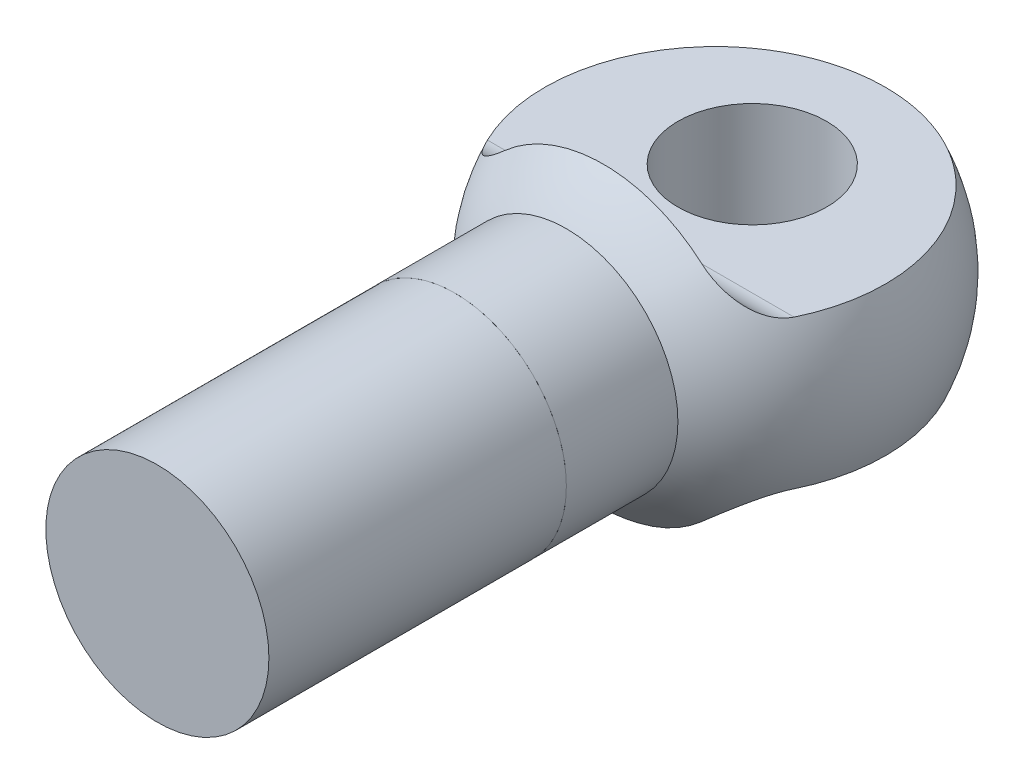
ISO-10303-21;
HEADER;
FILE_DESCRIPTION(('STEP AP214'),'2;1');
FILE_NAME('part.step','',(''),(''),'','','');
FILE_SCHEMA(('AUTOMOTIVE_DESIGN { 1 0 10303 214 1 1 1 1 }'));
ENDSEC;
DATA;
#1=APPLICATION_CONTEXT('core data for automotive mechanical design processes');
#2=APPLICATION_PROTOCOL_DEFINITION('international standard','automotive_design',2000,#1);
#3=PRODUCT_CONTEXT('',#1,'mechanical');
#4=PRODUCT('Part','Part','',(#3));
#5=PRODUCT_RELATED_PRODUCT_CATEGORY('part','',(#4));
#6=PRODUCT_DEFINITION_FORMATION('','',#4);
#7=PRODUCT_DEFINITION_CONTEXT('part definition',#1,'design');
#8=PRODUCT_DEFINITION('design','',#6,#7);
#9=PRODUCT_DEFINITION_SHAPE('','',#8);
#10=(LENGTH_UNIT() NAMED_UNIT(*) SI_UNIT(.MILLI.,.METRE.));
#11=(NAMED_UNIT(*) PLANE_ANGLE_UNIT() SI_UNIT($,.RADIAN.));
#12=(NAMED_UNIT(*) SI_UNIT($,.STERADIAN.) SOLID_ANGLE_UNIT());
#13=UNCERTAINTY_MEASURE_WITH_UNIT(LENGTH_MEASURE(1.E-05),#10,'distance_accuracy_value','');
#14=(GEOMETRIC_REPRESENTATION_CONTEXT(3) GLOBAL_UNCERTAINTY_ASSIGNED_CONTEXT((#13)) GLOBAL_UNIT_ASSIGNED_CONTEXT((#10,
#11,#12)) REPRESENTATION_CONTEXT('',''));
#15=CARTESIAN_POINT('',(0.,0.,0.));
#16=DIRECTION('',(0.,0.,1.));
#17=DIRECTION('',(1.,0.,0.));
#18=AXIS2_PLACEMENT_3D('',#15,#16,#17);
#19=CARTESIAN_POINT('',(0.,0.,-7.));
#20=DIRECTION('',(0.,0.,1.));
#21=DIRECTION('',(1.,0.,0.));
#22=AXIS2_PLACEMENT_3D('',#19,#20,#21);
#23=SPHERICAL_SURFACE('',#22,5.);
#24=CARTESIAN_POINT('',(0.,0.,-3.));
#25=DIRECTION('',(0.,0.,-1.));
#26=DIRECTION('',(-1.,0.,0.));
#27=AXIS2_PLACEMENT_3D('',#24,#25,#26);
#28=CIRCLE('',#27,3.);
#29=CARTESIAN_POINT('',(-3.,0.,-3.));
#30=VERTEX_POINT('',#29);
#31=EDGE_CURVE('E108',#30,#30,#28,.T.);
#32=ORIENTED_EDGE('',*,*,#31,.T.);
#33=EDGE_LOOP('',(#32));
#34=FACE_BOUND('',#33,.T.);
#35=CARTESIAN_POINT('',(0.,0.,-4.));
#36=DIRECTION('',(0.,0.,1.));
#37=DIRECTION('',(1.,0.,0.));
#38=AXIS2_PLACEMENT_3D('',#35,#36,#37);
#39=CIRCLE('',#38,4.);
#40=CARTESIAN_POINT('',(2.64575131106459,3.,-4.));
#41=VERTEX_POINT('',#40);
#42=CARTESIAN_POINT('',(-2.64575131106459,3.,-4.));
#43=VERTEX_POINT('',#42);
#44=EDGE_CURVE('E97',#41,#43,#39,.T.);
#45=ORIENTED_EDGE('',*,*,#44,.T.);
#46=CARTESIAN_POINT('',(-2.64575131106459,3.,-4.));
#47=CARTESIAN_POINT('',(-2.69458242415423,2.95696353764354,-4.00002383899075));
#48=CARTESIAN_POINT('',(-2.74370550671373,2.91427341673294,-4.00277899990163));
#49=CARTESIAN_POINT('',(-2.84220545277897,2.82981958380546,-4.01366065976888));
#50=CARTESIAN_POINT('',(-2.89158245101973,2.78805644375903,-4.02179038469079));
#51=CARTESIAN_POINT('',(-2.99053024429044,2.70546743096911,-4.04340162518348));
#52=CARTESIAN_POINT('',(-3.04010012746959,2.6646496926651,-4.05691856273508));
#53=CARTESIAN_POINT('',(-3.13876292442797,2.58464512082968,-4.08931723310009));
#54=CARTESIAN_POINT('',(-3.18785598452982,2.54545777402659,-4.10819726265431));
#55=CARTESIAN_POINT('',(-3.31481070913177,2.44601949470996,-4.16449549014562));
#56=CARTESIAN_POINT('',(-3.39209184791986,2.38738261465338,-4.20621643011181));
#57=CARTESIAN_POINT('',(-3.54302200764926,2.2781619656057,-4.30407595546875));
#58=CARTESIAN_POINT('',(-3.61667840049503,2.22756134233096,-4.36018370336249));
#59=CARTESIAN_POINT('',(-3.73928754899963,2.15008757295993,-4.47002509292647));
#60=CARTESIAN_POINT('',(-3.78956497050251,2.1204910962389,-4.5203546033238));
#61=CARTESIAN_POINT('',(-3.88574802317231,2.06961178003133,-4.62860338906412));
#62=CARTESIAN_POINT('',(-3.93166920177132,2.04829846360513,-4.68649377358041));
#63=CARTESIAN_POINT('',(-4.00214453296941,2.02206121396138,-4.7871916154429));
#64=CARTESIAN_POINT('',(-4.02845244345466,2.01400050166362,-4.82795598408216));
#65=CARTESIAN_POINT('',(-4.07816013871326,2.00296011607275,-4.91213087567134));
#66=CARTESIAN_POINT('',(-4.10154509143042,2.0000054528643,-4.95555335094543));
#67=CARTESIAN_POINT('',(-4.12310562561766,2.,-5.));
#68=B_SPLINE_CURVE_WITH_KNOTS('',3,(#46,#47,#48,#49,#50,#51,#52,#53,#54,#55,#56,#57,#58,#59,#60,
#61,#62,#63,#64,#65,#66,#67),.UNSPECIFIED.,.F.,.F.,(4,2,2,2,2,2,2,2,2,2,4),(0.,
0.195195044136388,0.390507356369892,0.587125650709548,0.783681570916079,1.0992579605892,
1.41416349952215,1.64455497496108,1.87409053909587,2.02124980792783,2.16912786007797),.UNSPECIFIED.);
#69=CARTESIAN_POINT('',(-4.12310562561766,2.,-5.));
#70=VERTEX_POINT('',#69);
#71=EDGE_CURVE('E93',#43,#70,#68,.T.);
#72=ORIENTED_EDGE('',*,*,#71,.T.);
#73=CARTESIAN_POINT('',(0.,2.,-7.));
#74=DIRECTION('',(0.,-1.,0.));
#75=DIRECTION('',(0.,0.,-1.));
#76=AXIS2_PLACEMENT_3D('',#73,#74,#75);
#77=CIRCLE('',#76,4.58257569495584);
#78=CARTESIAN_POINT('',(4.12310562561766,2.,-5.));
#79=VERTEX_POINT('',#78);
#80=EDGE_CURVE('E95',#70,#79,#77,.T.);
#81=ORIENTED_EDGE('',*,*,#80,.T.);
#82=CARTESIAN_POINT('',(4.12310562561766,2.,-5.));
#83=CARTESIAN_POINT('',(4.09313186050749,2.00002949748679,-4.9382207465853));
#84=CARTESIAN_POINT('',(4.05971073396143,2.00570946208169,-4.87854158957466));
#85=CARTESIAN_POINT('',(3.9877832975061,2.0263465034949,-4.76481228070074));
#86=CARTESIAN_POINT('',(3.94932922525889,2.04121343980338,-4.7107133247071));
#87=CARTESIAN_POINT('',(3.85741734017864,2.08336267656611,-4.59429666823457));
#88=CARTESIAN_POINT('',(3.80273853331143,2.11293277323871,-4.53379932320223));
#89=CARTESIAN_POINT('',(3.68881786037103,2.18098778358637,-4.42250864236689));
#90=CARTESIAN_POINT('',(3.62955528917084,2.21951494014308,-4.37176343824053));
#91=CARTESIAN_POINT('',(3.48826824495654,2.31662586486972,-4.26532668654957));
#92=CARTESIAN_POINT('',(3.40510632099552,2.37765842430899,-4.2133885323858));
#93=CARTESIAN_POINT('',(3.2358451895882,2.50704986537997,-4.12645352165781));
#94=CARTESIAN_POINT('',(3.14974507185081,2.5754110318186,-4.09146196732889));
#95=CARTESIAN_POINT('',(2.99349930364044,2.70280786997431,-4.04326125910103));
#96=CARTESIAN_POINT('',(2.92356711904682,2.76101291170021,-4.02711231963793));
#97=CARTESIAN_POINT('',(2.81893550239107,2.84973566460491,-4.01089963494242));
#98=CARTESIAN_POINT('',(2.7841707058168,2.87948601829577,-4.00683071329971));
#99=CARTESIAN_POINT('',(2.71480540680138,2.93942900045119,-4.00138409982716));
#100=CARTESIAN_POINT('',(2.68020492424758,2.96962168073173,-4.0000067258776));
#101=CARTESIAN_POINT('',(2.64575131106459,3.,-4.));
#102=B_SPLINE_CURVE_WITH_KNOTS('',3,(#82,#83,#84,#85,#86,#87,#88,#89,#90,#91,#92,#93,#94,#95,
#96,#97,#98,#99,#100,#101),.UNSPECIFIED.,.F.,.F.,(4,2,2,2,2,2,2,2,2,4),(0.,0.205092579444077,
0.408204104918547,0.66707003676107,0.927182515977707,1.27184076098277,1.61660677276189,
1.89316652724031,2.03090682988791,2.16866339911652),.UNSPECIFIED.);
#103=EDGE_CURVE('E102',#79,#41,#102,.T.);
#104=ORIENTED_EDGE('',*,*,#103,.T.);
#105=EDGE_LOOP('',(#45,#72,#81,#104));
#106=FACE_BOUND('',#105,.T.);
#107=CARTESIAN_POINT('',(0.,0.,-4.));
#108=DIRECTION('',(0.,0.,-1.));
#109=DIRECTION('',(-1.,0.,0.));
#110=AXIS2_PLACEMENT_3D('',#107,#108,#109);
#111=CIRCLE('',#110,4.);
#112=CARTESIAN_POINT('',(2.64575131106459,-3.,-4.));
#113=VERTEX_POINT('',#112);
#114=CARTESIAN_POINT('',(-2.64575131106459,-3.,-4.));
#115=VERTEX_POINT('',#114);
#116=EDGE_CURVE('E172',#113,#115,#111,.T.);
#117=ORIENTED_EDGE('',*,*,#116,.F.);
#118=CARTESIAN_POINT('',(2.64575131106459,-3.,-4.));
#119=CARTESIAN_POINT('',(2.69458242415423,-2.95696353764354,-4.00002383899075));
#120=CARTESIAN_POINT('',(2.74370550671373,-2.91427341673294,-4.00277899990163));
#121=CARTESIAN_POINT('',(2.84220545277896,-2.82981958380546,-4.01366065976888));
#122=CARTESIAN_POINT('',(2.89158245101972,-2.78805644375903,-4.02179038469079));
#123=CARTESIAN_POINT('',(2.99053024429044,-2.70546743096911,-4.04340162518348));
#124=CARTESIAN_POINT('',(3.04010012746958,-2.6646496926651,-4.05691856273508));
#125=CARTESIAN_POINT('',(3.13876292442797,-2.58464512082968,-4.08931723310009));
#126=CARTESIAN_POINT('',(3.18785598452981,-2.54545777402659,-4.10819726265431));
#127=CARTESIAN_POINT('',(3.31481070913177,-2.44601949470996,-4.16449549014562));
#128=CARTESIAN_POINT('',(3.39209184791986,-2.38738261465338,-4.20621643011181));
#129=CARTESIAN_POINT('',(3.54302200764926,-2.2781619656057,-4.30407595546875));
#130=CARTESIAN_POINT('',(3.61667840049503,-2.22756134233096,-4.36018370336249));
#131=CARTESIAN_POINT('',(3.73928754899962,-2.15008757295993,-4.47002509292647));
#132=CARTESIAN_POINT('',(3.78956497050251,-2.1204910962389,-4.5203546033238));
#133=CARTESIAN_POINT('',(3.88574802317231,-2.06961178003133,-4.62860338906412));
#134=CARTESIAN_POINT('',(3.93166920177132,-2.04829846360513,-4.68649377358041));
#135=CARTESIAN_POINT('',(4.0021445329694,-2.02206121396138,-4.7871916154429));
#136=CARTESIAN_POINT('',(4.02845244345466,-2.01400050166362,-4.82795598408215));
#137=CARTESIAN_POINT('',(4.07816013871326,-2.00296011607275,-4.91213087567134));
#138=CARTESIAN_POINT('',(4.10154509143042,-2.0000054528643,-4.95555335094543));
#139=CARTESIAN_POINT('',(4.12310562561766,-2.,-5.));
#140=B_SPLINE_CURVE_WITH_KNOTS('',3,(#118,#119,#120,#121,#122,#123,#124,#125,#126,#127,#128,
#129,#130,#131,#132,#133,#134,#135,#136,#137,#138,#139),.UNSPECIFIED.,.F.,.F.,(4,2,2,2,2,2,2,2,
2,2,4),(0.,0.195195044136388,0.390507356369892,0.587125650709548,0.783681570916078,
1.0992579605892,1.41416349952215,1.64455497496108,1.87409053909587,2.02124980792783,
2.16912786007797),.UNSPECIFIED.);
#141=CARTESIAN_POINT('',(4.12310562561766,-2.,-5.));
#142=VERTEX_POINT('',#141);
#143=EDGE_CURVE('E61',#113,#142,#140,.T.);
#144=ORIENTED_EDGE('',*,*,#143,.T.);
#145=CARTESIAN_POINT('',(0.,-2.,-7.));
#146=DIRECTION('',(0.,-1.,0.));
#147=DIRECTION('',(0.,0.,-1.));
#148=AXIS2_PLACEMENT_3D('',#145,#146,#147);
#149=CIRCLE('',#148,4.58257569495584);
#150=CARTESIAN_POINT('',(-4.12310562561766,-2.,-5.));
#151=VERTEX_POINT('',#150);
#152=EDGE_CURVE('E101',#151,#142,#149,.T.);
#153=ORIENTED_EDGE('',*,*,#152,.F.);
#154=CARTESIAN_POINT('',(-4.12310562561766,-2.,-5.));
#155=CARTESIAN_POINT('',(-4.0931318605075,-2.00002949748679,-4.9382207465853));
#156=CARTESIAN_POINT('',(-4.05971073396143,-2.00570946208169,-4.87854158957466));
#157=CARTESIAN_POINT('',(-3.9877832975061,-2.0263465034949,-4.76481228070074));
#158=CARTESIAN_POINT('',(-3.94932922525889,-2.04121343980338,-4.7107133247071));
#159=CARTESIAN_POINT('',(-3.85741734017864,-2.08336267656611,-4.59429666823457));
#160=CARTESIAN_POINT('',(-3.80273853331144,-2.11293277323871,-4.53379932320223));
#161=CARTESIAN_POINT('',(-3.68881786037103,-2.18098778358637,-4.4225086423669));
#162=CARTESIAN_POINT('',(-3.62955528917084,-2.21951494014308,-4.37176343824053));
#163=CARTESIAN_POINT('',(-3.48826824495654,-2.31662586486972,-4.26532668654957));
#164=CARTESIAN_POINT('',(-3.40510632099552,-2.37765842430899,-4.2133885323858));
#165=CARTESIAN_POINT('',(-3.2358451895882,-2.50704986537997,-4.12645352165782));
#166=CARTESIAN_POINT('',(-3.14974507185081,-2.5754110318186,-4.09146196732889));
#167=CARTESIAN_POINT('',(-2.99349930364044,-2.70280786997431,-4.04326125910103));
#168=CARTESIAN_POINT('',(-2.92356711904682,-2.76101291170021,-4.02711231963793));
#169=CARTESIAN_POINT('',(-2.81893550239107,-2.84973566460491,-4.01089963494242));
#170=CARTESIAN_POINT('',(-2.7841707058168,-2.87948601829577,-4.00683071329971));
#171=CARTESIAN_POINT('',(-2.71480540680138,-2.93942900045119,-4.00138409982716));
#172=CARTESIAN_POINT('',(-2.68020492424758,-2.96962168073173,-4.0000067258776));
#173=CARTESIAN_POINT('',(-2.64575131106459,-3.,-4.));
#174=B_SPLINE_CURVE_WITH_KNOTS('',3,(#154,#155,#156,#157,#158,#159,#160,#161,#162,#163,#164,
#165,#166,#167,#168,#169,#170,#171,#172,#173),.UNSPECIFIED.,.F.,.F.,(4,2,2,2,2,2,2,2,2,4),(0.,
0.205092579444077,0.408204104918547,0.667070036761069,0.927182515977706,1.27184076098277,
1.61660677276189,1.89316652724031,2.03090682988791,2.16866339911652),.UNSPECIFIED.);
#175=EDGE_CURVE('E12',#151,#115,#174,.T.);
#176=ORIENTED_EDGE('',*,*,#175,.T.);
#177=EDGE_LOOP('',(#117,#144,#153,#176));
#178=FACE_BOUND('',#177,.T.);
#179=ADVANCED_FACE('F51',(#34,#106,#178),#23,.T.);
#180=CARTESIAN_POINT('',(0.,0.,-3.));
#181=DIRECTION('',(0.,0.,1.));
#182=DIRECTION('',(1.,0.,0.));
#183=AXIS2_PLACEMENT_3D('',#180,#181,#182);
#184=CYLINDRICAL_SURFACE('',#183,3.);
#185=ORIENTED_EDGE('',*,*,#31,.F.);
#186=EDGE_LOOP('',(#185));
#187=FACE_BOUND('',#186,.T.);
#188=CARTESIAN_POINT('',(0.,0.,0.));
#189=DIRECTION('',(0.,0.,-1.));
#190=DIRECTION('',(-1.,0.,0.));
#191=AXIS2_PLACEMENT_3D('',#188,#189,#190);
#192=CIRCLE('',#191,3.);
#193=CARTESIAN_POINT('',(-3.,0.,0.));
#194=VERTEX_POINT('',#193);
#195=EDGE_CURVE('E153',#194,#194,#192,.T.);
#196=ORIENTED_EDGE('',*,*,#195,.T.);
#197=EDGE_LOOP('',(#196));
#198=FACE_BOUND('',#197,.T.);
#199=ADVANCED_FACE('F133',(#187,#198),#184,.T.);
#200=CARTESIAN_POINT('',(0.,0.,0.));
#201=DIRECTION('',(0.,0.,-1.));
#202=DIRECTION('',(-1.,0.,0.));
#203=AXIS2_PLACEMENT_3D('',#200,#201,#202);
#204=PLANE('',#203);
#205=ORIENTED_EDGE('',*,*,#195,.F.);
#206=EDGE_LOOP('',(#205));
#207=FACE_BOUND('',#206,.T.);
#208=ADVANCED_FACE('F136',(#207),#204,.F.);
#209=CARTESIAN_POINT('',(-5.,5.,-4.));
#210=DIRECTION('',(0.,0.,1.));
#211=DIRECTION('',(1.,0.,0.));
#212=AXIS2_PLACEMENT_3D('',#209,#210,#211);
#213=PLANE('',#212);
#214=ORIENTED_EDGE('',*,*,#44,.F.);
#215=DIRECTION('',(1.,0.,0.));
#216=VECTOR('',#215,1.);
#217=CARTESIAN_POINT('',(-3.46410161513775,3.,-4.));
#218=LINE('',#217,#216);
#219=EDGE_CURVE('E111',#41,#43,#218,.F.);
#220=ORIENTED_EDGE('',*,*,#219,.T.);
#221=EDGE_LOOP('',(#214,#220));
#222=FACE_BOUND('',#221,.T.);
#223=ADVANCED_FACE('F139',(#222),#213,.F.);
#224=CARTESIAN_POINT('',(-5.,2.,-4.));
#225=DIRECTION('',(0.,-1.,0.));
#226=DIRECTION('',(0.,0.,-1.));
#227=AXIS2_PLACEMENT_3D('',#224,#225,#226);
#228=PLANE('',#227);
#229=CARTESIAN_POINT('',(0.,2.,-8.));
#230=DIRECTION('',(0.,-1.,0.));
#231=DIRECTION('',(0.,0.,-1.));
#232=AXIS2_PLACEMENT_3D('',#229,#230,#231);
#233=CIRCLE('',#232,2.);
#234=CARTESIAN_POINT('',(0.,2.,-10.));
#235=VERTEX_POINT('',#234);
#236=EDGE_CURVE('E156',#235,#235,#233,.T.);
#237=ORIENTED_EDGE('',*,*,#236,.T.);
#238=EDGE_LOOP('',(#237));
#239=FACE_BOUND('',#238,.T.);
#240=ORIENTED_EDGE('',*,*,#80,.F.);
#241=DIRECTION('',(1.,0.,0.));
#242=VECTOR('',#241,1.);
#243=CARTESIAN_POINT('',(3.46410161513775,2.,-5.));
#244=LINE('',#243,#242);
#245=EDGE_CURVE('E107',#70,#79,#244,.T.);
#246=ORIENTED_EDGE('',*,*,#245,.T.);
#247=EDGE_LOOP('',(#240,#246));
#248=FACE_BOUND('',#247,.T.);
#249=ADVANCED_FACE('F106',(#239,#248),#228,.F.);
#250=CARTESIAN_POINT('',(-5.,3.,-5.));
#251=DIRECTION('',(-1.,0.,0.));
#252=DIRECTION('',(0.,0.,1.));
#253=AXIS2_PLACEMENT_3D('',#250,#251,#252);
#254=CYLINDRICAL_SURFACE('',#253,1.);
#255=ORIENTED_EDGE('',*,*,#71,.F.);
#256=ORIENTED_EDGE('',*,*,#219,.F.);
#257=ORIENTED_EDGE('',*,*,#103,.F.);
#258=ORIENTED_EDGE('',*,*,#245,.F.);
#259=EDGE_LOOP('',(#255,#256,#257,#258));
#260=FACE_BOUND('',#259,.T.);
#261=ADVANCED_FACE('F110',(#260),#254,.F.);
#262=CARTESIAN_POINT('',(-5.,-5.,-4.));
#263=DIRECTION('',(0.,0.,-1.));
#264=DIRECTION('',(-1.,0.,0.));
#265=AXIS2_PLACEMENT_3D('',#262,#263,#264);
#266=PLANE('',#265);
#267=ORIENTED_EDGE('',*,*,#116,.T.);
#268=DIRECTION('',(1.,0.,0.));
#269=VECTOR('',#268,1.);
#270=CARTESIAN_POINT('',(3.46410161513775,-3.,-4.));
#271=LINE('',#270,#269);
#272=EDGE_CURVE('E176',#115,#113,#271,.T.);
#273=ORIENTED_EDGE('',*,*,#272,.T.);
#274=EDGE_LOOP('',(#267,#273));
#275=FACE_BOUND('',#274,.T.);
#276=ADVANCED_FACE('F132',(#275),#266,.T.);
#277=CARTESIAN_POINT('',(-5.,-2.,-4.));
#278=DIRECTION('',(0.,-1.,0.));
#279=DIRECTION('',(0.,0.,-1.));
#280=AXIS2_PLACEMENT_3D('',#277,#278,#279);
#281=PLANE('',#280);
#282=CARTESIAN_POINT('',(0.,-2.,-8.));
#283=DIRECTION('',(0.,-1.,0.));
#284=DIRECTION('',(0.,0.,-1.));
#285=AXIS2_PLACEMENT_3D('',#282,#283,#284);
#286=CIRCLE('',#285,2.);
#287=CARTESIAN_POINT('',(0.,-2.,-10.));
#288=VERTEX_POINT('',#287);
#289=EDGE_CURVE('E56',#288,#288,#286,.T.);
#290=ORIENTED_EDGE('',*,*,#289,.F.);
#291=EDGE_LOOP('',(#290));
#292=FACE_BOUND('',#291,.T.);
#293=ORIENTED_EDGE('',*,*,#152,.T.);
#294=DIRECTION('',(1.,0.,0.));
#295=VECTOR('',#294,1.);
#296=CARTESIAN_POINT('',(-3.46410161513775,-2.,-5.));
#297=LINE('',#296,#295);
#298=EDGE_CURVE('E73',#142,#151,#297,.F.);
#299=ORIENTED_EDGE('',*,*,#298,.T.);
#300=EDGE_LOOP('',(#293,#299));
#301=FACE_BOUND('',#300,.T.);
#302=ADVANCED_FACE('F168',(#292,#301),#281,.T.);
#303=CARTESIAN_POINT('',(-5.,-3.,-5.));
#304=DIRECTION('',(-1.,0.,0.));
#305=DIRECTION('',(0.,0.,1.));
#306=AXIS2_PLACEMENT_3D('',#303,#304,#305);
#307=CYLINDRICAL_SURFACE('',#306,1.);
#308=ORIENTED_EDGE('',*,*,#175,.F.);
#309=ORIENTED_EDGE('',*,*,#298,.F.);
#310=ORIENTED_EDGE('',*,*,#143,.F.);
#311=ORIENTED_EDGE('',*,*,#272,.F.);
#312=EDGE_LOOP('',(#308,#309,#310,#311));
#313=FACE_BOUND('',#312,.T.);
#314=ADVANCED_FACE('F53',(#313),#307,.F.);
#315=CARTESIAN_POINT('',(0.,-4.,-8.));
#316=DIRECTION('',(0.,1.,0.));
#317=DIRECTION('',(0.,0.,1.));
#318=AXIS2_PLACEMENT_3D('',#315,#316,#317);
#319=CYLINDRICAL_SURFACE('',#318,2.);
#320=ORIENTED_EDGE('',*,*,#289,.T.);
#321=EDGE_LOOP('',(#320));
#322=FACE_BOUND('',#321,.T.);
#323=ORIENTED_EDGE('',*,*,#236,.F.);
#324=EDGE_LOOP('',(#323));
#325=FACE_BOUND('',#324,.T.);
#326=ADVANCED_FACE('F165',(#322,#325),#319,.F.);
#327=CLOSED_SHELL('',(#179,#199,#208,#223,#249,#261,#276,#302,#314,#326));
#328=MANIFOLD_SOLID_BREP('B2',#327);
#329=CARTESIAN_POINT('',(0.,0.,8.));
#330=DIRECTION('',(0.,0.,-1.));
#331=DIRECTION('',(-1.,0.,0.));
#332=AXIS2_PLACEMENT_3D('',#329,#330,#331);
#333=CYLINDRICAL_SURFACE('',#332,3.);
#334=CARTESIAN_POINT('',(0.,0.,8.));
#335=DIRECTION('',(0.,0.,1.));
#336=DIRECTION('',(1.,0.,0.));
#337=AXIS2_PLACEMENT_3D('',#334,#335,#336);
#338=CIRCLE('',#337,3.);
#339=CARTESIAN_POINT('',(3.,0.,8.));
#340=VERTEX_POINT('',#339);
#341=EDGE_CURVE('E50',#340,#340,#338,.T.);
#342=ORIENTED_EDGE('',*,*,#341,.F.);
#343=EDGE_LOOP('',(#342));
#344=FACE_BOUND('',#343,.T.);
#345=CARTESIAN_POINT('',(0.,0.,0.));
#346=DIRECTION('',(0.,0.,1.));
#347=DIRECTION('',(1.,0.,0.));
#348=AXIS2_PLACEMENT_3D('',#345,#346,#347);
#349=CIRCLE('',#348,3.);
#350=CARTESIAN_POINT('',(3.,0.,0.));
#351=VERTEX_POINT('',#350);
#352=EDGE_CURVE('E264',#351,#351,#349,.T.);
#353=ORIENTED_EDGE('',*,*,#352,.T.);
#354=EDGE_LOOP('',(#353));
#355=FACE_BOUND('',#354,.T.);
#356=ADVANCED_FACE('F261',(#344,#355),#333,.T.);
#357=CARTESIAN_POINT('',(0.,0.,8.));
#358=DIRECTION('',(0.,0.,1.));
#359=DIRECTION('',(1.,0.,0.));
#360=AXIS2_PLACEMENT_3D('',#357,#358,#359);
#361=PLANE('',#360);
#362=ORIENTED_EDGE('',*,*,#341,.T.);
#363=EDGE_LOOP('',(#362));
#364=FACE_BOUND('',#363,.T.);
#365=ADVANCED_FACE('F276',(#364),#361,.T.);
#366=CARTESIAN_POINT('',(0.,0.,0.));
#367=DIRECTION('',(0.,0.,1.));
#368=DIRECTION('',(1.,0.,0.));
#369=AXIS2_PLACEMENT_3D('',#366,#367,#368);
#370=PLANE('',#369);
#371=ORIENTED_EDGE('',*,*,#352,.F.);
#372=EDGE_LOOP('',(#371));
#373=FACE_BOUND('',#372,.T.);
#374=ADVANCED_FACE('F274',(#373),#370,.F.);
#375=CLOSED_SHELL('',(#356,#365,#374));
#376=MANIFOLD_SOLID_BREP('B6',#375);
#377=ADVANCED_BREP_SHAPE_REPRESENTATION('',(#18,#328,#376),#14);
#378=SHAPE_DEFINITION_REPRESENTATION(#9,#377);
ENDSEC;
END-ISO-10303-21;
